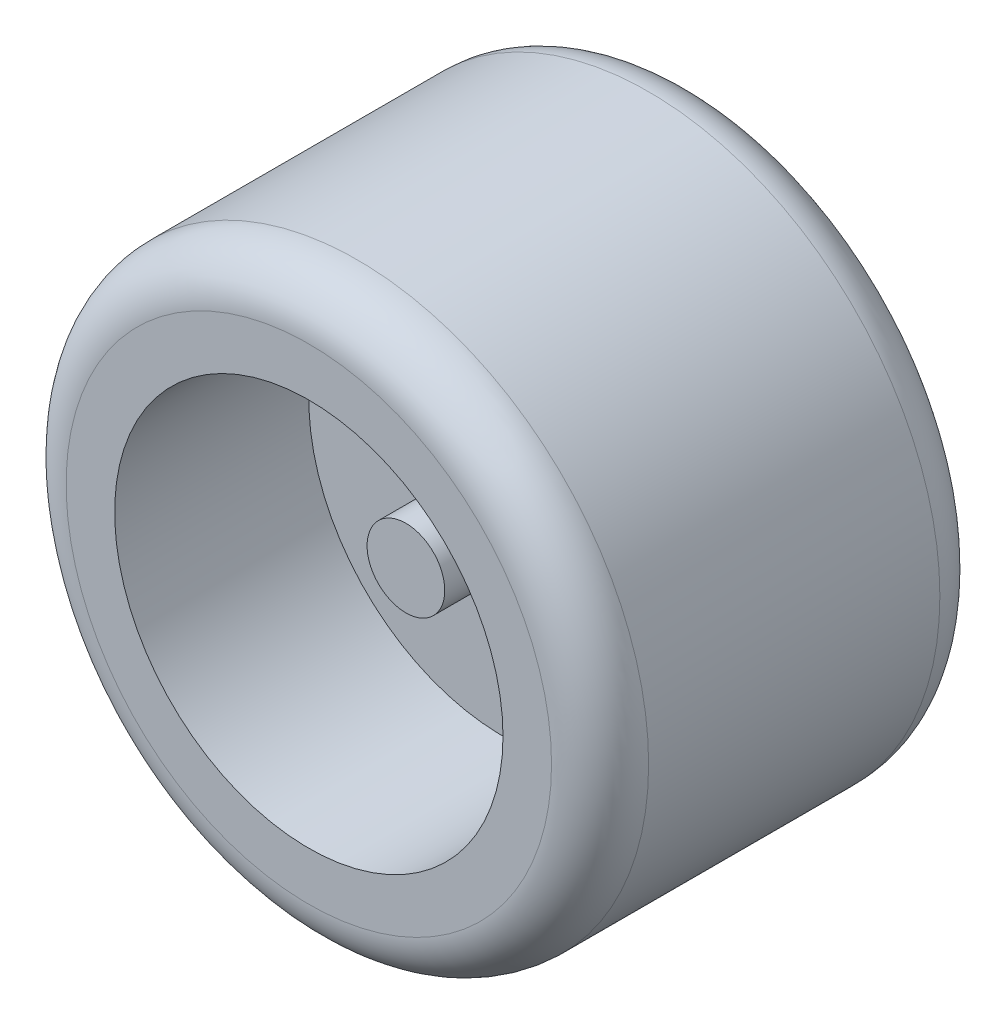
ISO-10303-21;
HEADER;
FILE_DESCRIPTION(('STEP AP214'),'2;1');
FILE_NAME('part.step','',(''),(''),'','','');
FILE_SCHEMA(('AUTOMOTIVE_DESIGN { 1 0 10303 214 1 1 1 1 }'));
ENDSEC;
DATA;
#1=APPLICATION_CONTEXT('core data for automotive mechanical design processes');
#2=APPLICATION_PROTOCOL_DEFINITION('international standard','automotive_design',2000,#1);
#3=PRODUCT_CONTEXT('',#1,'mechanical');
#4=PRODUCT('Part','Part','',(#3));
#5=PRODUCT_RELATED_PRODUCT_CATEGORY('part','',(#4));
#6=PRODUCT_DEFINITION_FORMATION('','',#4);
#7=PRODUCT_DEFINITION_CONTEXT('part definition',#1,'design');
#8=PRODUCT_DEFINITION('design','',#6,#7);
#9=PRODUCT_DEFINITION_SHAPE('','',#8);
#10=(LENGTH_UNIT() NAMED_UNIT(*) SI_UNIT(.MILLI.,.METRE.));
#11=(NAMED_UNIT(*) PLANE_ANGLE_UNIT() SI_UNIT($,.RADIAN.));
#12=(NAMED_UNIT(*) SI_UNIT($,.STERADIAN.) SOLID_ANGLE_UNIT());
#13=UNCERTAINTY_MEASURE_WITH_UNIT(LENGTH_MEASURE(1.E-05),#10,'distance_accuracy_value','');
#14=(GEOMETRIC_REPRESENTATION_CONTEXT(3) GLOBAL_UNCERTAINTY_ASSIGNED_CONTEXT((#13)) GLOBAL_UNIT_ASSIGNED_CONTEXT((#10,
#11,#12)) REPRESENTATION_CONTEXT('',''));
#15=CARTESIAN_POINT('',(0.,0.,0.));
#16=DIRECTION('',(0.,0.,1.));
#17=DIRECTION('',(1.,0.,0.));
#18=AXIS2_PLACEMENT_3D('',#15,#16,#17);
#19=CARTESIAN_POINT('',(0.,0.,2.));
#20=DIRECTION('',(0.,0.,-1.));
#21=DIRECTION('',(-1.,0.,0.));
#22=AXIS2_PLACEMENT_3D('',#19,#20,#21);
#23=PLANE('',#22);
#24=CARTESIAN_POINT('',(0.,0.,2.));
#25=DIRECTION('',(0.,0.,-1.));
#26=DIRECTION('',(-1.,0.,0.));
#27=AXIS2_PLACEMENT_3D('',#24,#25,#26);
#28=CIRCLE('',#27,10.);
#29=CARTESIAN_POINT('',(-10.,0.,2.));
#30=VERTEX_POINT('',#29);
#31=EDGE_CURVE('E56',#30,#30,#28,.T.);
#32=ORIENTED_EDGE('',*,*,#31,.T.);
#33=EDGE_LOOP('',(#32));
#34=FACE_BOUND('',#33,.T.);
#35=CARTESIAN_POINT('',(0.,0.,2.));
#36=DIRECTION('',(0.,0.,-1.));
#37=DIRECTION('',(-1.,0.,0.));
#38=AXIS2_PLACEMENT_3D('',#35,#36,#37);
#39=CIRCLE('',#38,2.);
#40=CARTESIAN_POINT('',(-2.,0.,2.));
#41=VERTEX_POINT('',#40);
#42=EDGE_CURVE('E71',#41,#41,#39,.T.);
#43=ORIENTED_EDGE('',*,*,#42,.F.);
#44=EDGE_LOOP('',(#43));
#45=FACE_BOUND('',#44,.T.);
#46=ADVANCED_FACE('F32',(#34,#45),#23,.T.);
#47=CARTESIAN_POINT('',(0.,0.,10.));
#48=DIRECTION('',(0.,0.,1.));
#49=DIRECTION('',(1.,0.,0.));
#50=AXIS2_PLACEMENT_3D('',#47,#48,#49);
#51=PLANE('',#50);
#52=CARTESIAN_POINT('',(0.,0.,10.));
#53=DIRECTION('',(0.,0.,1.));
#54=DIRECTION('',(1.,0.,0.));
#55=AXIS2_PLACEMENT_3D('',#52,#53,#54);
#56=CIRCLE('',#55,10.);
#57=CARTESIAN_POINT('',(10.,0.,10.));
#58=VERTEX_POINT('',#57);
#59=EDGE_CURVE('E52',#58,#58,#56,.T.);
#60=ORIENTED_EDGE('',*,*,#59,.T.);
#61=EDGE_LOOP('',(#60));
#62=FACE_BOUND('',#61,.T.);
#63=CARTESIAN_POINT('',(0.,0.,10.));
#64=DIRECTION('',(0.,0.,1.));
#65=DIRECTION('',(1.,0.,0.));
#66=AXIS2_PLACEMENT_3D('',#63,#64,#65);
#67=CIRCLE('',#66,2.);
#68=CARTESIAN_POINT('',(2.,0.,10.));
#69=VERTEX_POINT('',#68);
#70=EDGE_CURVE('E65',#69,#69,#67,.T.);
#71=ORIENTED_EDGE('',*,*,#70,.F.);
#72=EDGE_LOOP('',(#71));
#73=FACE_BOUND('',#72,.T.);
#74=ADVANCED_FACE('F87',(#62,#73),#51,.T.);
#75=CARTESIAN_POINT('',(0.,0.,20.));
#76=DIRECTION('',(0.,0.,-1.));
#77=DIRECTION('',(-1.,0.,0.));
#78=AXIS2_PLACEMENT_3D('',#75,#76,#77);
#79=CYLINDRICAL_SURFACE('',#78,15.);
#80=CARTESIAN_POINT('',(0.,0.,2.5));
#81=DIRECTION('',(0.,0.,1.));
#82=DIRECTION('',(1.,0.,0.));
#83=AXIS2_PLACEMENT_3D('',#80,#81,#82);
#84=CIRCLE('',#83,15.);
#85=CARTESIAN_POINT('',(15.,0.,2.5));
#86=VERTEX_POINT('',#85);
#87=EDGE_CURVE('E39',#86,#86,#84,.T.);
#88=ORIENTED_EDGE('',*,*,#87,.T.);
#89=EDGE_LOOP('',(#88));
#90=FACE_BOUND('',#89,.T.);
#91=CARTESIAN_POINT('',(0.,0.,17.5));
#92=DIRECTION('',(0.,0.,1.));
#93=DIRECTION('',(1.,0.,0.));
#94=AXIS2_PLACEMENT_3D('',#91,#92,#93);
#95=CIRCLE('',#94,15.);
#96=CARTESIAN_POINT('',(15.,0.,17.5));
#97=VERTEX_POINT('',#96);
#98=EDGE_CURVE('E43',#97,#97,#95,.F.);
#99=ORIENTED_EDGE('',*,*,#98,.T.);
#100=EDGE_LOOP('',(#99));
#101=FACE_BOUND('',#100,.T.);
#102=ADVANCED_FACE('F93',(#90,#101),#79,.T.);
#103=CARTESIAN_POINT('',(0.,0.,20.));
#104=DIRECTION('',(0.,0.,1.));
#105=DIRECTION('',(1.,0.,0.));
#106=AXIS2_PLACEMENT_3D('',#103,#104,#105);
#107=PLANE('',#106);
#108=CARTESIAN_POINT('',(0.,0.,20.));
#109=DIRECTION('',(0.,0.,1.));
#110=DIRECTION('',(1.,0.,0.));
#111=AXIS2_PLACEMENT_3D('',#108,#109,#110);
#112=CIRCLE('',#111,12.5);
#113=CARTESIAN_POINT('',(12.5,0.,20.));
#114=VERTEX_POINT('',#113);
#115=EDGE_CURVE('E47',#114,#114,#112,.T.);
#116=ORIENTED_EDGE('',*,*,#115,.T.);
#117=EDGE_LOOP('',(#116));
#118=FACE_BOUND('',#117,.T.);
#119=CARTESIAN_POINT('',(0.,0.,20.));
#120=DIRECTION('',(0.,0.,1.));
#121=DIRECTION('',(1.,0.,0.));
#122=AXIS2_PLACEMENT_3D('',#119,#120,#121);
#123=CIRCLE('',#122,10.);
#124=CARTESIAN_POINT('',(10.,0.,20.));
#125=VERTEX_POINT('',#124);
#126=EDGE_CURVE('E53',#125,#125,#123,.T.);
#127=ORIENTED_EDGE('',*,*,#126,.F.);
#128=EDGE_LOOP('',(#127));
#129=FACE_BOUND('',#128,.T.);
#130=ADVANCED_FACE('F109',(#118,#129),#107,.T.);
#131=CARTESIAN_POINT('',(0.,0.,0.));
#132=DIRECTION('',(0.,0.,1.));
#133=DIRECTION('',(1.,0.,0.));
#134=AXIS2_PLACEMENT_3D('',#131,#132,#133);
#135=PLANE('',#134);
#136=CARTESIAN_POINT('',(0.,0.,0.));
#137=DIRECTION('',(0.,0.,1.));
#138=DIRECTION('',(1.,0.,0.));
#139=AXIS2_PLACEMENT_3D('',#136,#137,#138);
#140=CIRCLE('',#139,12.5);
#141=CARTESIAN_POINT('',(12.5,0.,0.));
#142=VERTEX_POINT('',#141);
#143=EDGE_CURVE('E10',#142,#142,#140,.F.);
#144=ORIENTED_EDGE('',*,*,#143,.T.);
#145=EDGE_LOOP('',(#144));
#146=FACE_BOUND('',#145,.T.);
#147=CARTESIAN_POINT('',(0.,0.,0.));
#148=DIRECTION('',(0.,0.,-1.));
#149=DIRECTION('',(-1.,0.,0.));
#150=AXIS2_PLACEMENT_3D('',#147,#148,#149);
#151=CIRCLE('',#150,10.);
#152=CARTESIAN_POINT('',(-10.,0.,0.));
#153=VERTEX_POINT('',#152);
#154=EDGE_CURVE('E59',#153,#153,#151,.T.);
#155=ORIENTED_EDGE('',*,*,#154,.F.);
#156=EDGE_LOOP('',(#155));
#157=FACE_BOUND('',#156,.T.);
#158=ADVANCED_FACE('F107',(#146,#157),#135,.F.);
#159=CARTESIAN_POINT('',(0.,0.,10.));
#160=DIRECTION('',(0.,0.,1.));
#161=DIRECTION('',(1.,0.,0.));
#162=AXIS2_PLACEMENT_3D('',#159,#160,#161);
#163=CYLINDRICAL_SURFACE('',#162,10.);
#164=ORIENTED_EDGE('',*,*,#59,.F.);
#165=EDGE_LOOP('',(#164));
#166=FACE_BOUND('',#165,.T.);
#167=ORIENTED_EDGE('',*,*,#126,.T.);
#168=EDGE_LOOP('',(#167));
#169=FACE_BOUND('',#168,.T.);
#170=ADVANCED_FACE('F102',(#166,#169),#163,.F.);
#171=CARTESIAN_POINT('',(0.,0.,2.));
#172=DIRECTION('',(0.,0.,-1.));
#173=DIRECTION('',(-1.,0.,0.));
#174=AXIS2_PLACEMENT_3D('',#171,#172,#173);
#175=CYLINDRICAL_SURFACE('',#174,10.);
#176=ORIENTED_EDGE('',*,*,#31,.F.);
#177=EDGE_LOOP('',(#176));
#178=FACE_BOUND('',#177,.T.);
#179=ORIENTED_EDGE('',*,*,#154,.T.);
#180=EDGE_LOOP('',(#179));
#181=FACE_BOUND('',#180,.T.);
#182=ADVANCED_FACE('F100',(#178,#181),#175,.F.);
#183=CARTESIAN_POINT('',(0.,0.,15.));
#184=DIRECTION('',(0.,0.,-1.));
#185=DIRECTION('',(-1.,0.,0.));
#186=AXIS2_PLACEMENT_3D('',#183,#184,#185);
#187=CYLINDRICAL_SURFACE('',#186,2.);
#188=CARTESIAN_POINT('',(0.,0.,15.));
#189=DIRECTION('',(0.,0.,1.));
#190=DIRECTION('',(1.,0.,0.));
#191=AXIS2_PLACEMENT_3D('',#188,#189,#190);
#192=CIRCLE('',#191,2.);
#193=CARTESIAN_POINT('',(2.,0.,15.));
#194=VERTEX_POINT('',#193);
#195=EDGE_CURVE('E62',#194,#194,#192,.T.);
#196=ORIENTED_EDGE('',*,*,#195,.F.);
#197=EDGE_LOOP('',(#196));
#198=FACE_BOUND('',#197,.T.);
#199=ORIENTED_EDGE('',*,*,#70,.T.);
#200=EDGE_LOOP('',(#199));
#201=FACE_BOUND('',#200,.T.);
#202=ADVANCED_FACE('F98',(#198,#201),#187,.T.);
#203=CARTESIAN_POINT('',(0.,0.,15.));
#204=DIRECTION('',(0.,0.,1.));
#205=DIRECTION('',(1.,0.,0.));
#206=AXIS2_PLACEMENT_3D('',#203,#204,#205);
#207=PLANE('',#206);
#208=ORIENTED_EDGE('',*,*,#195,.T.);
#209=EDGE_LOOP('',(#208));
#210=FACE_BOUND('',#209,.T.);
#211=ADVANCED_FACE('F82',(#210),#207,.T.);
#212=CARTESIAN_POINT('',(0.,0.,0.));
#213=DIRECTION('',(0.,0.,1.));
#214=DIRECTION('',(1.,0.,0.));
#215=AXIS2_PLACEMENT_3D('',#212,#213,#214);
#216=CYLINDRICAL_SURFACE('',#215,2.);
#217=CARTESIAN_POINT('',(0.,0.,0.));
#218=DIRECTION('',(0.,0.,-1.));
#219=DIRECTION('',(-1.,0.,0.));
#220=AXIS2_PLACEMENT_3D('',#217,#218,#219);
#221=CIRCLE('',#220,2.);
#222=CARTESIAN_POINT('',(-2.,0.,0.));
#223=VERTEX_POINT('',#222);
#224=EDGE_CURVE('E68',#223,#223,#221,.T.);
#225=ORIENTED_EDGE('',*,*,#224,.F.);
#226=EDGE_LOOP('',(#225));
#227=FACE_BOUND('',#226,.T.);
#228=ORIENTED_EDGE('',*,*,#42,.T.);
#229=EDGE_LOOP('',(#228));
#230=FACE_BOUND('',#229,.T.);
#231=ADVANCED_FACE('F79',(#227,#230),#216,.T.);
#232=CARTESIAN_POINT('',(0.,0.,0.));
#233=DIRECTION('',(0.,0.,-1.));
#234=DIRECTION('',(-1.,0.,0.));
#235=AXIS2_PLACEMENT_3D('',#232,#233,#234);
#236=PLANE('',#235);
#237=ORIENTED_EDGE('',*,*,#224,.T.);
#238=EDGE_LOOP('',(#237));
#239=FACE_BOUND('',#238,.T.);
#240=ADVANCED_FACE('F77',(#239),#236,.T.);
#241=CARTESIAN_POINT('',(0.,0.,17.5));
#242=DIRECTION('',(0.,0.,1.));
#243=DIRECTION('',(1.,0.,0.));
#244=AXIS2_PLACEMENT_3D('',#241,#242,#243);
#245=TOROIDAL_SURFACE('',#244,12.5,2.5);
#246=ORIENTED_EDGE('',*,*,#98,.F.);
#247=EDGE_LOOP('',(#246));
#248=FACE_BOUND('',#247,.T.);
#249=ORIENTED_EDGE('',*,*,#115,.F.);
#250=EDGE_LOOP('',(#249));
#251=FACE_BOUND('',#250,.T.);
#252=ADVANCED_FACE('F116',(#248,#251),#245,.T.);
#253=CARTESIAN_POINT('',(0.,0.,2.5));
#254=DIRECTION('',(0.,0.,1.));
#255=DIRECTION('',(1.,0.,0.));
#256=AXIS2_PLACEMENT_3D('',#253,#254,#255);
#257=TOROIDAL_SURFACE('',#256,12.5,2.5);
#258=ORIENTED_EDGE('',*,*,#143,.F.);
#259=EDGE_LOOP('',(#258));
#260=FACE_BOUND('',#259,.T.);
#261=ORIENTED_EDGE('',*,*,#87,.F.);
#262=EDGE_LOOP('',(#261));
#263=FACE_BOUND('',#262,.T.);
#264=ADVANCED_FACE('F34',(#260,#263),#257,.T.);
#265=CLOSED_SHELL('',(#46,#74,#102,#130,#158,#170,#182,#202,#211,#231,#240,#252,#264));
#266=MANIFOLD_SOLID_BREP('B2',#265);
#267=ADVANCED_BREP_SHAPE_REPRESENTATION('',(#18,#266),#14);
#268=SHAPE_DEFINITION_REPRESENTATION(#9,#267);
ENDSEC;
END-ISO-10303-21;
